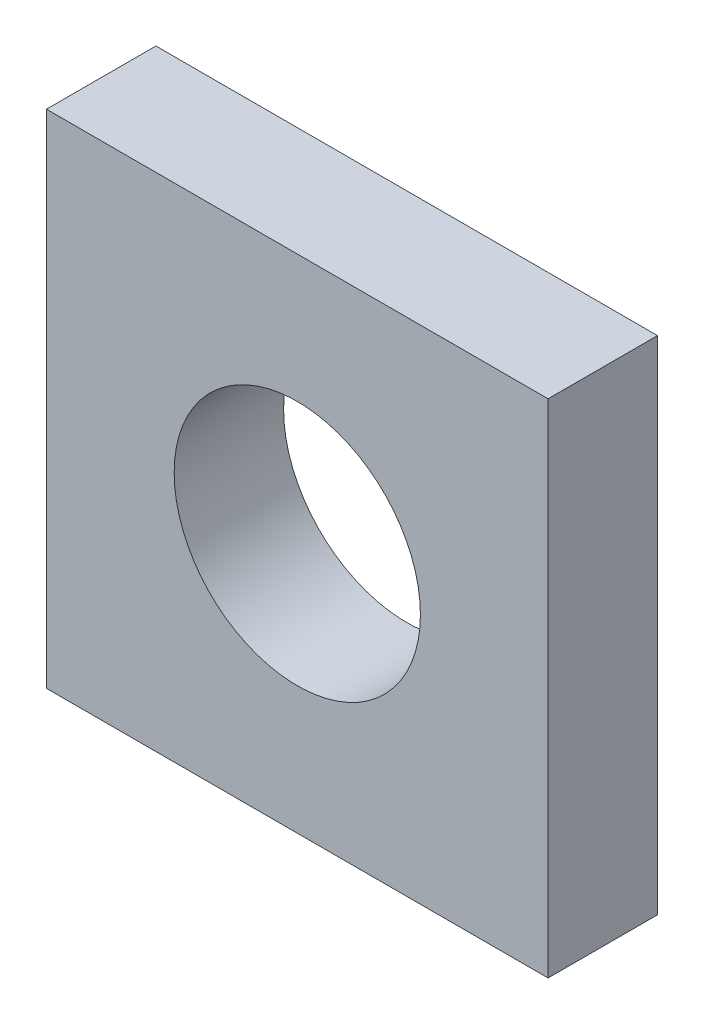
ISO-10303-21;
HEADER;
FILE_DESCRIPTION(('STEP AP214'),'2;1');
FILE_NAME('part.step','',(''),(''),'','','');
FILE_SCHEMA(('AUTOMOTIVE_DESIGN { 1 0 10303 214 1 1 1 1 }'));
ENDSEC;
DATA;
#1=APPLICATION_CONTEXT('core data for automotive mechanical design processes');
#2=APPLICATION_PROTOCOL_DEFINITION('international standard','automotive_design',2000,#1);
#3=PRODUCT_CONTEXT('',#1,'mechanical');
#4=PRODUCT('Part','Part','',(#3));
#5=PRODUCT_RELATED_PRODUCT_CATEGORY('part','',(#4));
#6=PRODUCT_DEFINITION_FORMATION('','',#4);
#7=PRODUCT_DEFINITION_CONTEXT('part definition',#1,'design');
#8=PRODUCT_DEFINITION('design','',#6,#7);
#9=PRODUCT_DEFINITION_SHAPE('','',#8);
#10=(LENGTH_UNIT() NAMED_UNIT(*) SI_UNIT(.MILLI.,.METRE.));
#11=(NAMED_UNIT(*) PLANE_ANGLE_UNIT() SI_UNIT($,.RADIAN.));
#12=(NAMED_UNIT(*) SI_UNIT($,.STERADIAN.) SOLID_ANGLE_UNIT());
#13=UNCERTAINTY_MEASURE_WITH_UNIT(LENGTH_MEASURE(1.E-05),#10,'distance_accuracy_value','');
#14=(GEOMETRIC_REPRESENTATION_CONTEXT(3) GLOBAL_UNCERTAINTY_ASSIGNED_CONTEXT((#13)) GLOBAL_UNIT_ASSIGNED_CONTEXT((#10,
#11,#12)) REPRESENTATION_CONTEXT('',''));
#15=CARTESIAN_POINT('',(0.,0.,0.));
#16=DIRECTION('',(0.,0.,1.));
#17=DIRECTION('',(1.,0.,0.));
#18=AXIS2_PLACEMENT_3D('',#15,#16,#17);
#19=CARTESIAN_POINT('',(0.,0.,0.6));
#20=DIRECTION('',(0.,0.,1.));
#21=DIRECTION('',(1.,0.,0.));
#22=AXIS2_PLACEMENT_3D('',#19,#20,#21);
#23=PLANE('',#22);
#24=DIRECTION('',(0.,-1.,0.));
#25=VECTOR('',#24,1.);
#26=CARTESIAN_POINT('',(-2.75,2.75,0.6));
#27=LINE('',#26,#25);
#28=CARTESIAN_POINT('',(-2.75,2.75,0.6));
#29=VERTEX_POINT('',#28);
#30=CARTESIAN_POINT('',(-2.75,-2.75,0.6));
#31=VERTEX_POINT('',#30);
#32=EDGE_CURVE('E88',#29,#31,#27,.T.);
#33=ORIENTED_EDGE('',*,*,#32,.T.);
#34=DIRECTION('',(1.,0.,0.));
#35=VECTOR('',#34,1.);
#36=CARTESIAN_POINT('',(-2.75,-2.75,0.6));
#37=LINE('',#36,#35);
#38=CARTESIAN_POINT('',(2.75,-2.75,0.6));
#39=VERTEX_POINT('',#38);
#40=EDGE_CURVE('E83',#31,#39,#37,.T.);
#41=ORIENTED_EDGE('',*,*,#40,.T.);
#42=DIRECTION('',(0.,1.,0.));
#43=VECTOR('',#42,1.);
#44=CARTESIAN_POINT('',(2.75,2.75,0.6));
#45=LINE('',#44,#43);
#46=CARTESIAN_POINT('',(2.75,2.75,0.6));
#47=VERTEX_POINT('',#46);
#48=EDGE_CURVE('E86',#39,#47,#45,.T.);
#49=ORIENTED_EDGE('',*,*,#48,.T.);
#50=DIRECTION('',(-1.,0.,0.));
#51=VECTOR('',#50,1.);
#52=CARTESIAN_POINT('',(-2.75,2.75,0.6));
#53=LINE('',#52,#51);
#54=EDGE_CURVE('E53',#47,#29,#53,.T.);
#55=ORIENTED_EDGE('',*,*,#54,.T.);
#56=EDGE_LOOP('',(#33,#41,#49,#55));
#57=FACE_BOUND('',#56,.T.);
#58=CARTESIAN_POINT('',(0.,0.,0.6));
#59=DIRECTION('',(0.,0.,1.));
#60=DIRECTION('',(1.,0.,0.));
#61=AXIS2_PLACEMENT_3D('',#58,#59,#60);
#62=CIRCLE('',#61,1.35);
#63=CARTESIAN_POINT('',(1.35,0.,0.6));
#64=VERTEX_POINT('',#63);
#65=EDGE_CURVE('E103',#64,#64,#62,.T.);
#66=ORIENTED_EDGE('',*,*,#65,.F.);
#67=EDGE_LOOP('',(#66));
#68=FACE_BOUND('',#67,.T.);
#69=ADVANCED_FACE('F36',(#57,#68),#23,.T.);
#70=CARTESIAN_POINT('',(0.,0.,-0.6));
#71=DIRECTION('',(0.,0.,1.));
#72=DIRECTION('',(1.,0.,0.));
#73=AXIS2_PLACEMENT_3D('',#70,#71,#72);
#74=PLANE('',#73);
#75=DIRECTION('',(0.,-1.,0.));
#76=VECTOR('',#75,1.);
#77=CARTESIAN_POINT('',(-2.75,2.75,-0.6));
#78=LINE('',#77,#76);
#79=CARTESIAN_POINT('',(-2.75,2.75,-0.6));
#80=VERTEX_POINT('',#79);
#81=CARTESIAN_POINT('',(-2.75,-2.75,-0.6));
#82=VERTEX_POINT('',#81);
#83=EDGE_CURVE('E100',#80,#82,#78,.T.);
#84=ORIENTED_EDGE('',*,*,#83,.F.);
#85=DIRECTION('',(-1.,0.,0.));
#86=VECTOR('',#85,1.);
#87=CARTESIAN_POINT('',(-2.75,2.75,-0.6));
#88=LINE('',#87,#86);
#89=CARTESIAN_POINT('',(2.75,2.75,-0.6));
#90=VERTEX_POINT('',#89);
#91=EDGE_CURVE('E76',#90,#80,#88,.T.);
#92=ORIENTED_EDGE('',*,*,#91,.F.);
#93=DIRECTION('',(0.,1.,0.));
#94=VECTOR('',#93,1.);
#95=CARTESIAN_POINT('',(2.75,2.75,-0.6));
#96=LINE('',#95,#94);
#97=CARTESIAN_POINT('',(2.75,-2.75,-0.6));
#98=VERTEX_POINT('',#97);
#99=EDGE_CURVE('E70',#98,#90,#96,.T.);
#100=ORIENTED_EDGE('',*,*,#99,.F.);
#101=DIRECTION('',(1.,0.,0.));
#102=VECTOR('',#101,1.);
#103=CARTESIAN_POINT('',(-2.75,-2.75,-0.6));
#104=LINE('',#103,#102);
#105=EDGE_CURVE('E92',#82,#98,#104,.T.);
#106=ORIENTED_EDGE('',*,*,#105,.F.);
#107=EDGE_LOOP('',(#84,#92,#100,#106));
#108=FACE_BOUND('',#107,.T.);
#109=CARTESIAN_POINT('',(0.,0.,-0.6));
#110=DIRECTION('',(0.,0.,1.));
#111=DIRECTION('',(1.,0.,0.));
#112=AXIS2_PLACEMENT_3D('',#109,#110,#111);
#113=CIRCLE('',#112,1.35);
#114=CARTESIAN_POINT('',(1.35,0.,-0.6));
#115=VERTEX_POINT('',#114);
#116=EDGE_CURVE('E115',#115,#115,#113,.T.);
#117=ORIENTED_EDGE('',*,*,#116,.T.);
#118=EDGE_LOOP('',(#117));
#119=FACE_BOUND('',#118,.T.);
#120=ADVANCED_FACE('F111',(#108,#119),#74,.F.);
#121=CARTESIAN_POINT('',(-2.75,2.75,0.6));
#122=DIRECTION('',(1.,0.,0.));
#123=DIRECTION('',(0.,0.,-1.));
#124=AXIS2_PLACEMENT_3D('',#121,#122,#123);
#125=PLANE('',#124);
#126=ORIENTED_EDGE('',*,*,#83,.T.);
#127=DIRECTION('',(0.,0.,-1.));
#128=VECTOR('',#127,1.);
#129=CARTESIAN_POINT('',(-2.75,-2.75,0.6));
#130=LINE('',#129,#128);
#131=EDGE_CURVE('E11',#31,#82,#130,.T.);
#132=ORIENTED_EDGE('',*,*,#131,.F.);
#133=ORIENTED_EDGE('',*,*,#32,.F.);
#134=DIRECTION('',(0.,0.,-1.));
#135=VECTOR('',#134,1.);
#136=CARTESIAN_POINT('',(-2.75,2.75,0.6));
#137=LINE('',#136,#135);
#138=EDGE_CURVE('E96',#29,#80,#137,.T.);
#139=ORIENTED_EDGE('',*,*,#138,.T.);
#140=EDGE_LOOP('',(#126,#132,#133,#139));
#141=FACE_BOUND('',#140,.T.);
#142=ADVANCED_FACE('F38',(#141),#125,.F.);
#143=CARTESIAN_POINT('',(-2.75,-2.75,0.6));
#144=DIRECTION('',(0.,1.,0.));
#145=DIRECTION('',(0.,0.,1.));
#146=AXIS2_PLACEMENT_3D('',#143,#144,#145);
#147=PLANE('',#146);
#148=ORIENTED_EDGE('',*,*,#105,.T.);
#149=DIRECTION('',(0.,0.,-1.));
#150=VECTOR('',#149,1.);
#151=CARTESIAN_POINT('',(2.75,-2.75,0.6));
#152=LINE('',#151,#150);
#153=EDGE_CURVE('E45',#39,#98,#152,.T.);
#154=ORIENTED_EDGE('',*,*,#153,.F.);
#155=ORIENTED_EDGE('',*,*,#40,.F.);
#156=ORIENTED_EDGE('',*,*,#131,.T.);
#157=EDGE_LOOP('',(#148,#154,#155,#156));
#158=FACE_BOUND('',#157,.T.);
#159=ADVANCED_FACE('F91',(#158),#147,.F.);
#160=CARTESIAN_POINT('',(2.75,2.75,0.6));
#161=DIRECTION('',(-1.,0.,0.));
#162=DIRECTION('',(0.,-1.,0.));
#163=AXIS2_PLACEMENT_3D('',#160,#161,#162);
#164=PLANE('',#163);
#165=ORIENTED_EDGE('',*,*,#99,.T.);
#166=DIRECTION('',(0.,0.,-1.));
#167=VECTOR('',#166,1.);
#168=CARTESIAN_POINT('',(2.75,2.75,0.6));
#169=LINE('',#168,#167);
#170=EDGE_CURVE('E93',#47,#90,#169,.T.);
#171=ORIENTED_EDGE('',*,*,#170,.F.);
#172=ORIENTED_EDGE('',*,*,#48,.F.);
#173=ORIENTED_EDGE('',*,*,#153,.T.);
#174=EDGE_LOOP('',(#165,#171,#172,#173));
#175=FACE_BOUND('',#174,.T.);
#176=ADVANCED_FACE('F94',(#175),#164,.F.);
#177=CARTESIAN_POINT('',(-2.75,2.75,0.6));
#178=DIRECTION('',(0.,-1.,0.));
#179=DIRECTION('',(0.,0.,-1.));
#180=AXIS2_PLACEMENT_3D('',#177,#178,#179);
#181=PLANE('',#180);
#182=ORIENTED_EDGE('',*,*,#91,.T.);
#183=ORIENTED_EDGE('',*,*,#138,.F.);
#184=ORIENTED_EDGE('',*,*,#54,.F.);
#185=ORIENTED_EDGE('',*,*,#170,.T.);
#186=EDGE_LOOP('',(#182,#183,#184,#185));
#187=FACE_BOUND('',#186,.T.);
#188=ADVANCED_FACE('F108',(#187),#181,.F.);
#189=CARTESIAN_POINT('',(0.,0.,0.6));
#190=DIRECTION('',(0.,0.,-1.));
#191=DIRECTION('',(-1.,0.,0.));
#192=AXIS2_PLACEMENT_3D('',#189,#190,#191);
#193=CYLINDRICAL_SURFACE('',#192,1.35);
#194=ORIENTED_EDGE('',*,*,#65,.T.);
#195=EDGE_LOOP('',(#194));
#196=FACE_BOUND('',#195,.T.);
#197=ORIENTED_EDGE('',*,*,#116,.F.);
#198=EDGE_LOOP('',(#197));
#199=FACE_BOUND('',#198,.T.);
#200=ADVANCED_FACE('F121',(#196,#199),#193,.F.);
#201=CLOSED_SHELL('',(#69,#120,#142,#159,#176,#188,#200));
#202=MANIFOLD_SOLID_BREP('B2',#201);
#203=ADVANCED_BREP_SHAPE_REPRESENTATION('',(#18,#202),#14);
#204=SHAPE_DEFINITION_REPRESENTATION(#9,#203);
ENDSEC;
END-ISO-10303-21;
